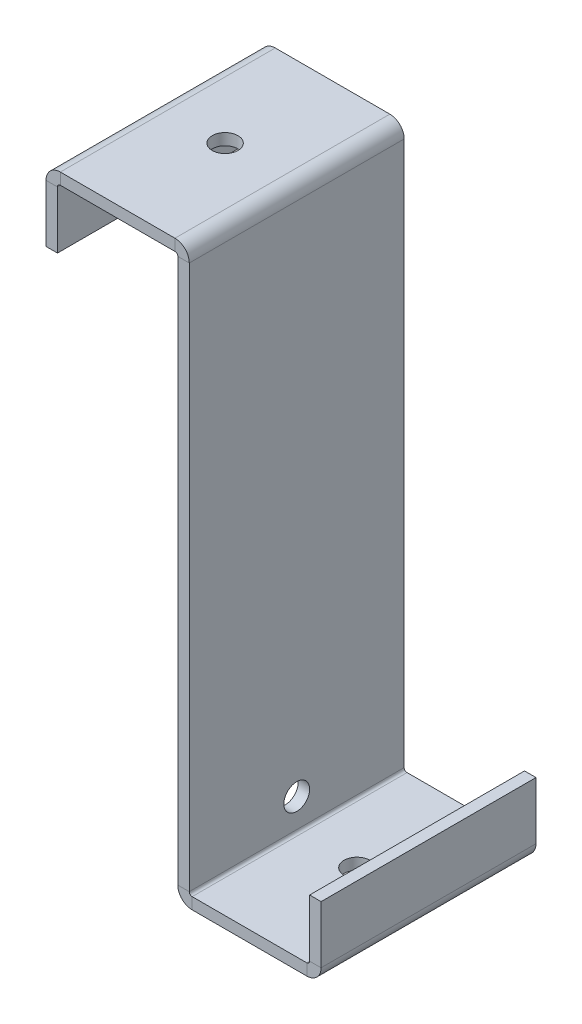
ISO-10303-21;
HEADER;
FILE_DESCRIPTION(('STEP AP214'),'2;1');
FILE_NAME('part.step','',(''),(''),'','','');
FILE_SCHEMA(('AUTOMOTIVE_DESIGN { 1 0 10303 214 1 1 1 1 }'));
ENDSEC;
DATA;
#1=APPLICATION_CONTEXT('core data for automotive mechanical design processes');
#2=APPLICATION_PROTOCOL_DEFINITION('international standard','automotive_design',2000,#1);
#3=PRODUCT_CONTEXT('',#1,'mechanical');
#4=PRODUCT('Part','Part','',(#3));
#5=PRODUCT_RELATED_PRODUCT_CATEGORY('part','',(#4));
#6=PRODUCT_DEFINITION_FORMATION('','',#4);
#7=PRODUCT_DEFINITION_CONTEXT('part definition',#1,'design');
#8=PRODUCT_DEFINITION('design','',#6,#7);
#9=PRODUCT_DEFINITION_SHAPE('','',#8);
#10=(LENGTH_UNIT() NAMED_UNIT(*) SI_UNIT(.MILLI.,.METRE.));
#11=(NAMED_UNIT(*) PLANE_ANGLE_UNIT() SI_UNIT($,.RADIAN.));
#12=(NAMED_UNIT(*) SI_UNIT($,.STERADIAN.) SOLID_ANGLE_UNIT());
#13=UNCERTAINTY_MEASURE_WITH_UNIT(LENGTH_MEASURE(1.E-05),#10,'distance_accuracy_value','');
#14=(GEOMETRIC_REPRESENTATION_CONTEXT(3) GLOBAL_UNCERTAINTY_ASSIGNED_CONTEXT((#13)) GLOBAL_UNIT_ASSIGNED_CONTEXT((#10,
#11,#12)) REPRESENTATION_CONTEXT('',''));
#15=CARTESIAN_POINT('',(0.,0.,0.));
#16=DIRECTION('',(0.,0.,1.));
#17=DIRECTION('',(1.,0.,0.));
#18=AXIS2_PLACEMENT_3D('',#15,#16,#17);
#19=CARTESIAN_POINT('',(3.99999999999999,0.,-37.5));
#20=DIRECTION('',(0.,0.,1.));
#21=DIRECTION('',(1.,0.,0.));
#22=AXIS2_PLACEMENT_3D('',#19,#20,#21);
#23=PLANE('',#22);
#24=DIRECTION('',(-1.24900090270315E-13,-1.,0.));
#25=VECTOR('',#24,1.);
#26=CARTESIAN_POINT('',(45.,3.99999999999973,-37.5));
#27=LINE('',#26,#25);
#28=CARTESIAN_POINT('',(45.,3.99999999999973,-37.5));
#29=VERTEX_POINT('',#28);
#30=CARTESIAN_POINT('',(44.9999999999995,-2.70616862252382E-13,-37.5));
#31=VERTEX_POINT('',#30);
#32=EDGE_CURVE('E303',#29,#31,#27,.T.);
#33=ORIENTED_EDGE('',*,*,#32,.T.);
#34=DIRECTION('',(-1.,0.,0.));
#35=VECTOR('',#34,1.);
#36=CARTESIAN_POINT('',(3.99999999999999,0.,-37.5));
#37=LINE('',#36,#35);
#38=CARTESIAN_POINT('',(4.99999999999998,0.,-37.5));
#39=VERTEX_POINT('',#38);
#40=EDGE_CURVE('E369',#39,#31,#37,.F.);
#41=ORIENTED_EDGE('',*,*,#40,.F.);
#42=DIRECTION('',(0.,1.,0.));
#43=VECTOR('',#42,1.);
#44=CARTESIAN_POINT('',(5.,3.99999999999999,-37.5));
#45=LINE('',#44,#43);
#46=CARTESIAN_POINT('',(5.,3.99999999999999,-37.5));
#47=VERTEX_POINT('',#46);
#48=EDGE_CURVE('E380',#47,#39,#45,.F.);
#49=ORIENTED_EDGE('',*,*,#48,.F.);
#50=DIRECTION('',(1.,0.,0.));
#51=VECTOR('',#50,1.);
#52=CARTESIAN_POINT('',(4.,3.99999999999999,-37.5));
#53=LINE('',#52,#51);
#54=EDGE_CURVE('E374',#47,#29,#53,.T.);
#55=ORIENTED_EDGE('',*,*,#54,.T.);
#56=EDGE_LOOP('',(#33,#41,#49,#55));
#57=FACE_BOUND('',#56,.T.);
#58=ADVANCED_FACE('F114',(#57),#23,.F.);
#59=CARTESIAN_POINT('',(50.,-1.67400815431762E-13,37.5));
#60=DIRECTION('',(0.,0.,-1.));
#61=DIRECTION('',(-1.,0.,0.));
#62=AXIS2_PLACEMENT_3D('',#59,#60,#61);
#63=PLANE('',#62);
#64=DIRECTION('',(-1.28369537222268E-13,-1.,0.));
#65=VECTOR('',#64,1.);
#66=CARTESIAN_POINT('',(44.9999999999998,3.99999999999973,37.5));
#67=LINE('',#66,#65);
#68=CARTESIAN_POINT('',(44.9999999999998,3.99999999999973,37.5));
#69=VERTEX_POINT('',#68);
#70=CARTESIAN_POINT('',(44.9999999999997,-1.50089628796475E-13,37.5));
#71=VERTEX_POINT('',#70);
#72=EDGE_CURVE('E310',#69,#71,#67,.T.);
#73=ORIENTED_EDGE('',*,*,#72,.F.);
#74=DIRECTION('',(-1.,0.,0.));
#75=VECTOR('',#74,1.);
#76=CARTESIAN_POINT('',(50.,3.99999999999983,37.5));
#77=LINE('',#76,#75);
#78=CARTESIAN_POINT('',(5.,3.99999999999999,37.5));
#79=VERTEX_POINT('',#78);
#80=EDGE_CURVE('E372',#69,#79,#77,.T.);
#81=ORIENTED_EDGE('',*,*,#80,.T.);
#82=DIRECTION('',(0.,1.,0.));
#83=VECTOR('',#82,1.);
#84=CARTESIAN_POINT('',(4.99999999999998,0.,37.5));
#85=LINE('',#84,#83);
#86=CARTESIAN_POINT('',(4.99999999999998,0.,37.5));
#87=VERTEX_POINT('',#86);
#88=EDGE_CURVE('E363',#79,#87,#85,.F.);
#89=ORIENTED_EDGE('',*,*,#88,.T.);
#90=DIRECTION('',(1.,0.,0.));
#91=VECTOR('',#90,1.);
#92=CARTESIAN_POINT('',(4.00000000000002,0.,37.5));
#93=LINE('',#92,#91);
#94=EDGE_CURVE('E366',#71,#87,#93,.F.);
#95=ORIENTED_EDGE('',*,*,#94,.F.);
#96=EDGE_LOOP('',(#73,#81,#89,#95));
#97=FACE_BOUND('',#96,.T.);
#98=ADVANCED_FACE('F519',(#97),#63,.F.);
#99=CARTESIAN_POINT('',(3.99999999999999,0.,-37.5));
#100=DIRECTION('',(0.,-1.,0.));
#101=DIRECTION('',(1.,0.,0.));
#102=AXIS2_PLACEMENT_3D('',#99,#100,#101);
#103=PLANE('',#102);
#104=CARTESIAN_POINT('',(25.0000000000003,0.,0.));
#105=DIRECTION('',(0.,-1.,0.));
#106=DIRECTION('',(1.,0.,0.));
#107=AXIS2_PLACEMENT_3D('',#104,#105,#106);
#108=CIRCLE('',#107,4.5);
#109=CARTESIAN_POINT('',(29.5000000000003,-1.02348685082633E-13,0.));
#110=VERTEX_POINT('',#109);
#111=EDGE_CURVE('E558',#110,#110,#108,.T.);
#112=ORIENTED_EDGE('',*,*,#111,.F.);
#113=EDGE_LOOP('',(#112));
#114=FACE_BOUND('',#113,.T.);
#115=ORIENTED_EDGE('',*,*,#40,.T.);
#116=DIRECTION('',(0.,0.,-1.));
#117=VECTOR('',#116,1.);
#118=CARTESIAN_POINT('',(44.9999999999995,-2.70616862252382E-13,-37.5));
#119=LINE('',#118,#117);
#120=EDGE_CURVE('E257',#31,#71,#119,.F.);
#121=ORIENTED_EDGE('',*,*,#120,.T.);
#122=ORIENTED_EDGE('',*,*,#94,.T.);
#123=DIRECTION('',(0.,0.,-1.));
#124=VECTOR('',#123,1.);
#125=CARTESIAN_POINT('',(4.99999999999998,0.,-37.5));
#126=LINE('',#125,#124);
#127=EDGE_CURVE('E377',#87,#39,#126,.T.);
#128=ORIENTED_EDGE('',*,*,#127,.T.);
#129=EDGE_LOOP('',(#115,#121,#122,#128));
#130=FACE_BOUND('',#129,.T.);
#131=ADVANCED_FACE('F533',(#114,#130),#103,.T.);
#132=CARTESIAN_POINT('',(4.,3.99999999999999,-37.5));
#133=DIRECTION('',(0.,-1.,0.));
#134=DIRECTION('',(1.,0.,0.));
#135=AXIS2_PLACEMENT_3D('',#132,#133,#134);
#136=PLANE('',#135);
#137=CARTESIAN_POINT('',(25.0000000000004,3.99999999999991,0.));
#138=DIRECTION('',(0.,-1.,0.));
#139=DIRECTION('',(1.,0.,0.));
#140=AXIS2_PLACEMENT_3D('',#137,#138,#139);
#141=CIRCLE('',#140,4.5);
#142=CARTESIAN_POINT('',(29.5000000000004,3.9999999999999,0.));
#143=VERTEX_POINT('',#142);
#144=EDGE_CURVE('E555',#143,#143,#141,.T.);
#145=ORIENTED_EDGE('',*,*,#144,.T.);
#146=EDGE_LOOP('',(#145));
#147=FACE_BOUND('',#146,.T.);
#148=DIRECTION('',(0.,0.,-1.));
#149=VECTOR('',#148,1.);
#150=CARTESIAN_POINT('',(45.,3.99999999999973,-37.5));
#151=LINE('',#150,#149);
#152=EDGE_CURVE('E307',#29,#69,#151,.F.);
#153=ORIENTED_EDGE('',*,*,#152,.F.);
#154=ORIENTED_EDGE('',*,*,#54,.F.);
#155=DIRECTION('',(0.,0.,1.));
#156=VECTOR('',#155,1.);
#157=CARTESIAN_POINT('',(5.,3.99999999999999,37.5));
#158=LINE('',#157,#156);
#159=EDGE_CURVE('E383',#79,#47,#158,.F.);
#160=ORIENTED_EDGE('',*,*,#159,.F.);
#161=ORIENTED_EDGE('',*,*,#80,.F.);
#162=EDGE_LOOP('',(#153,#154,#160,#161));
#163=FACE_BOUND('',#162,.T.);
#164=ADVANCED_FACE('F523',(#147,#163),#136,.F.);
#165=CARTESIAN_POINT('',(0.,200.,-37.5));
#166=DIRECTION('',(0.,0.,-1.));
#167=DIRECTION('',(-1.,0.,0.));
#168=AXIS2_PLACEMENT_3D('',#165,#166,#167);
#169=PLANE('',#168);
#170=DIRECTION('',(-1.,0.,0.));
#171=VECTOR('',#170,1.);
#172=CARTESIAN_POINT('',(0.,196.,-37.5));
#173=LINE('',#172,#171);
#174=CARTESIAN_POINT('',(-41.,196.,-37.5000000000002));
#175=VERTEX_POINT('',#174);
#176=CARTESIAN_POINT('',(-1.,196.,-37.5));
#177=VERTEX_POINT('',#176);
#178=EDGE_CURVE('E416',#175,#177,#173,.F.);
#179=ORIENTED_EDGE('',*,*,#178,.F.);
#180=DIRECTION('',(0.,1.,0.));
#181=VECTOR('',#180,1.);
#182=CARTESIAN_POINT('',(-41.,196.,-37.5000000000002));
#183=LINE('',#182,#181);
#184=CARTESIAN_POINT('',(-41.,200.,-37.5000000000002));
#185=VERTEX_POINT('',#184);
#186=EDGE_CURVE('E351',#175,#185,#183,.T.);
#187=ORIENTED_EDGE('',*,*,#186,.T.);
#188=DIRECTION('',(1.,0.,0.));
#189=VECTOR('',#188,1.);
#190=CARTESIAN_POINT('',(0.,200.,-37.5));
#191=LINE('',#190,#189);
#192=CARTESIAN_POINT('',(-0.999999999999986,200.,-37.5));
#193=VERTEX_POINT('',#192);
#194=EDGE_CURVE('E410',#185,#193,#191,.T.);
#195=ORIENTED_EDGE('',*,*,#194,.T.);
#196=DIRECTION('',(0.,1.,0.));
#197=VECTOR('',#196,1.);
#198=CARTESIAN_POINT('',(-1.,196.,-37.5));
#199=LINE('',#198,#197);
#200=EDGE_CURVE('E424',#177,#193,#199,.T.);
#201=ORIENTED_EDGE('',*,*,#200,.F.);
#202=EDGE_LOOP('',(#179,#187,#195,#201));
#203=FACE_BOUND('',#202,.T.);
#204=ADVANCED_FACE('F497',(#203),#169,.T.);
#205=CARTESIAN_POINT('',(0.,200.,-37.5));
#206=DIRECTION('',(0.,1.,0.));
#207=DIRECTION('',(-1.,0.,0.));
#208=AXIS2_PLACEMENT_3D('',#205,#206,#207);
#209=PLANE('',#208);
#210=CARTESIAN_POINT('',(-20.9999999999996,200.,-1.48029736616688E-13));
#211=DIRECTION('',(0.,1.,0.));
#212=DIRECTION('',(-1.,0.,0.));
#213=AXIS2_PLACEMENT_3D('',#210,#211,#212);
#214=CIRCLE('',#213,4.5);
#215=CARTESIAN_POINT('',(-25.4999999999996,200.,-1.48029736616688E-13));
#216=VERTEX_POINT('',#215);
#217=EDGE_CURVE('E552',#216,#216,#214,.T.);
#218=ORIENTED_EDGE('',*,*,#217,.F.);
#219=EDGE_LOOP('',(#218));
#220=FACE_BOUND('',#219,.T.);
#221=ORIENTED_EDGE('',*,*,#194,.F.);
#222=DIRECTION('',(0.,0.,-1.));
#223=VECTOR('',#222,1.);
#224=CARTESIAN_POINT('',(-41.,200.,-37.5000000000002));
#225=LINE('',#224,#223);
#226=CARTESIAN_POINT('',(-41.,200.,37.4999999999998));
#227=VERTEX_POINT('',#226);
#228=EDGE_CURVE('E346',#185,#227,#225,.F.);
#229=ORIENTED_EDGE('',*,*,#228,.T.);
#230=DIRECTION('',(-1.,0.,0.));
#231=VECTOR('',#230,1.);
#232=CARTESIAN_POINT('',(-46.,200.,37.4999999999998));
#233=LINE('',#232,#231);
#234=CARTESIAN_POINT('',(-0.999999999999986,200.,37.5));
#235=VERTEX_POINT('',#234);
#236=EDGE_CURVE('E413',#235,#227,#233,.T.);
#237=ORIENTED_EDGE('',*,*,#236,.F.);
#238=DIRECTION('',(0.,0.,-1.));
#239=VECTOR('',#238,1.);
#240=CARTESIAN_POINT('',(-0.999999999999986,200.,-37.5));
#241=LINE('',#240,#239);
#242=EDGE_CURVE('E421',#235,#193,#241,.T.);
#243=ORIENTED_EDGE('',*,*,#242,.T.);
#244=EDGE_LOOP('',(#221,#229,#237,#243));
#245=FACE_BOUND('',#244,.T.);
#246=ADVANCED_FACE('F490',(#220,#245),#209,.T.);
#247=CARTESIAN_POINT('',(0.,196.,-37.5));
#248=DIRECTION('',(0.,1.,0.));
#249=DIRECTION('',(-1.,0.,0.));
#250=AXIS2_PLACEMENT_3D('',#247,#248,#249);
#251=PLANE('',#250);
#252=CARTESIAN_POINT('',(-20.9999999999996,196.,-1.48399810958229E-13));
#253=DIRECTION('',(0.,1.,0.));
#254=DIRECTION('',(-1.,0.,0.));
#255=AXIS2_PLACEMENT_3D('',#252,#253,#254);
#256=CIRCLE('',#255,4.5);
#257=CARTESIAN_POINT('',(-25.4999999999996,196.,-1.48399810958229E-13));
#258=VERTEX_POINT('',#257);
#259=EDGE_CURVE('E301',#258,#258,#256,.T.);
#260=ORIENTED_EDGE('',*,*,#259,.T.);
#261=EDGE_LOOP('',(#260));
#262=FACE_BOUND('',#261,.T.);
#263=DIRECTION('',(0.,0.,-1.));
#264=VECTOR('',#263,1.);
#265=CARTESIAN_POINT('',(-41.,196.,-37.5000000000002));
#266=LINE('',#265,#264);
#267=CARTESIAN_POINT('',(-41.,196.,37.4999999999998));
#268=VERTEX_POINT('',#267);
#269=EDGE_CURVE('E357',#175,#268,#266,.F.);
#270=ORIENTED_EDGE('',*,*,#269,.F.);
#271=ORIENTED_EDGE('',*,*,#178,.T.);
#272=DIRECTION('',(0.,0.,1.));
#273=VECTOR('',#272,1.);
#274=CARTESIAN_POINT('',(-1.,196.,37.4999999999999));
#275=LINE('',#274,#273);
#276=CARTESIAN_POINT('',(-1.,196.,37.5));
#277=VERTEX_POINT('',#276);
#278=EDGE_CURVE('E427',#277,#177,#275,.F.);
#279=ORIENTED_EDGE('',*,*,#278,.F.);
#280=DIRECTION('',(1.,0.,0.));
#281=VECTOR('',#280,1.);
#282=CARTESIAN_POINT('',(-3.1677559126533E-13,196.,37.5));
#283=LINE('',#282,#281);
#284=EDGE_CURVE('E418',#277,#268,#283,.F.);
#285=ORIENTED_EDGE('',*,*,#284,.T.);
#286=EDGE_LOOP('',(#270,#271,#279,#285));
#287=FACE_BOUND('',#286,.T.);
#288=ADVANCED_FACE('F479',(#262,#287),#251,.F.);
#289=CARTESIAN_POINT('',(4.,200.,37.5));
#290=DIRECTION('',(0.,0.,-1.));
#291=DIRECTION('',(0.,1.,0.));
#292=AXIS2_PLACEMENT_3D('',#289,#290,#291);
#293=PLANE('',#292);
#294=DIRECTION('',(-1.,0.,0.));
#295=VECTOR('',#294,1.);
#296=CARTESIAN_POINT('',(4.,4.99999999999999,37.5));
#297=LINE('',#296,#295);
#298=CARTESIAN_POINT('',(4.,4.99999999999999,37.5));
#299=VERTEX_POINT('',#298);
#300=CARTESIAN_POINT('',(0.,4.99999999999998,37.5));
#301=VERTEX_POINT('',#300);
#302=EDGE_CURVE('E404',#299,#301,#297,.T.);
#303=ORIENTED_EDGE('',*,*,#302,.F.);
#304=DIRECTION('',(0.,-1.,0.));
#305=VECTOR('',#304,1.);
#306=CARTESIAN_POINT('',(4.,200.,37.5));
#307=LINE('',#306,#305);
#308=CARTESIAN_POINT('',(4.,195.,37.5));
#309=VERTEX_POINT('',#308);
#310=EDGE_CURVE('E123',#309,#299,#307,.T.);
#311=ORIENTED_EDGE('',*,*,#310,.F.);
#312=DIRECTION('',(1.,0.,0.));
#313=VECTOR('',#312,1.);
#314=CARTESIAN_POINT('',(0.,195.,37.5));
#315=LINE('',#314,#313);
#316=CARTESIAN_POINT('',(0.,195.,37.5));
#317=VERTEX_POINT('',#316);
#318=EDGE_CURVE('E449',#317,#309,#315,.T.);
#319=ORIENTED_EDGE('',*,*,#318,.F.);
#320=DIRECTION('',(0.,-1.,0.));
#321=VECTOR('',#320,1.);
#322=CARTESIAN_POINT('',(0.,200.,37.5));
#323=LINE('',#322,#321);
#324=EDGE_CURVE('E452',#317,#301,#323,.T.);
#325=ORIENTED_EDGE('',*,*,#324,.T.);
#326=EDGE_LOOP('',(#303,#311,#319,#325));
#327=FACE_BOUND('',#326,.T.);
#328=ADVANCED_FACE('F116',(#327),#293,.F.);
#329=CARTESIAN_POINT('',(4.,200.,-37.5));
#330=DIRECTION('',(0.,0.,1.));
#331=DIRECTION('',(0.,-1.,0.));
#332=AXIS2_PLACEMENT_3D('',#329,#330,#331);
#333=PLANE('',#332);
#334=DIRECTION('',(-1.,0.,0.));
#335=VECTOR('',#334,1.);
#336=CARTESIAN_POINT('',(4.,4.99999999999999,-37.5));
#337=LINE('',#336,#335);
#338=CARTESIAN_POINT('',(4.,4.99999999999999,-37.5));
#339=VERTEX_POINT('',#338);
#340=CARTESIAN_POINT('',(0.,4.99999999999999,-37.5));
#341=VERTEX_POINT('',#340);
#342=EDGE_CURVE('E394',#339,#341,#337,.T.);
#343=ORIENTED_EDGE('',*,*,#342,.T.);
#344=DIRECTION('',(0.,1.,0.));
#345=VECTOR('',#344,1.);
#346=CARTESIAN_POINT('',(0.,200.,-37.5));
#347=LINE('',#346,#345);
#348=CARTESIAN_POINT('',(0.,195.,-37.5));
#349=VERTEX_POINT('',#348);
#350=EDGE_CURVE('E118',#341,#349,#347,.T.);
#351=ORIENTED_EDGE('',*,*,#350,.T.);
#352=DIRECTION('',(1.,0.,0.));
#353=VECTOR('',#352,1.);
#354=CARTESIAN_POINT('',(0.,195.,-37.5));
#355=LINE('',#354,#353);
#356=CARTESIAN_POINT('',(4.00000000000002,195.,-37.5));
#357=VERTEX_POINT('',#356);
#358=EDGE_CURVE('E438',#349,#357,#355,.T.);
#359=ORIENTED_EDGE('',*,*,#358,.T.);
#360=DIRECTION('',(0.,1.,0.));
#361=VECTOR('',#360,1.);
#362=CARTESIAN_POINT('',(4.,200.,-37.5));
#363=LINE('',#362,#361);
#364=EDGE_CURVE('E13',#339,#357,#363,.T.);
#365=ORIENTED_EDGE('',*,*,#364,.F.);
#366=EDGE_LOOP('',(#343,#351,#359,#365));
#367=FACE_BOUND('',#366,.T.);
#368=ADVANCED_FACE('F462',(#367),#333,.F.);
#369=CARTESIAN_POINT('',(4.,0.,37.5));
#370=DIRECTION('',(-1.,0.,0.));
#371=DIRECTION('',(0.,0.,1.));
#372=AXIS2_PLACEMENT_3D('',#369,#370,#371);
#373=PLANE('',#372);
#374=CARTESIAN_POINT('',(4.,15.0000000000009,0.));
#375=DIRECTION('',(-1.,0.,0.));
#376=DIRECTION('',(0.,0.,1.));
#377=AXIS2_PLACEMENT_3D('',#374,#375,#376);
#378=CIRCLE('',#377,4.5);
#379=CARTESIAN_POINT('',(4.,15.0000000000009,4.5));
#380=VERTEX_POINT('',#379);
#381=EDGE_CURVE('E561',#380,#380,#378,.T.);
#382=ORIENTED_EDGE('',*,*,#381,.T.);
#383=EDGE_LOOP('',(#382));
#384=FACE_BOUND('',#383,.T.);
#385=DIRECTION('',(0.,0.,-1.));
#386=VECTOR('',#385,1.);
#387=CARTESIAN_POINT('',(4.,4.99999999999999,-37.5));
#388=LINE('',#387,#386);
#389=EDGE_CURVE('E400',#339,#299,#388,.F.);
#390=ORIENTED_EDGE('',*,*,#389,.F.);
#391=ORIENTED_EDGE('',*,*,#364,.T.);
#392=DIRECTION('',(0.,0.,-1.));
#393=VECTOR('',#392,1.);
#394=CARTESIAN_POINT('',(4.00000000000002,195.,-37.5));
#395=LINE('',#394,#393);
#396=EDGE_CURVE('E432',#357,#309,#395,.F.);
#397=ORIENTED_EDGE('',*,*,#396,.T.);
#398=ORIENTED_EDGE('',*,*,#310,.T.);
#399=EDGE_LOOP('',(#390,#391,#397,#398));
#400=FACE_BOUND('',#399,.T.);
#401=ADVANCED_FACE('F507',(#384,#400),#373,.F.);
#402=CARTESIAN_POINT('',(0.,0.,37.5));
#403=DIRECTION('',(-1.,0.,0.));
#404=DIRECTION('',(0.,0.,1.));
#405=AXIS2_PLACEMENT_3D('',#402,#403,#404);
#406=PLANE('',#405);
#407=CARTESIAN_POINT('',(0.,15.0000000000009,0.));
#408=DIRECTION('',(-1.,0.,0.));
#409=DIRECTION('',(0.,0.,1.));
#410=AXIS2_PLACEMENT_3D('',#407,#408,#409);
#411=CIRCLE('',#410,4.5);
#412=CARTESIAN_POINT('',(0.,15.0000000000009,4.5));
#413=VERTEX_POINT('',#412);
#414=EDGE_CURVE('E564',#413,#413,#411,.T.);
#415=ORIENTED_EDGE('',*,*,#414,.F.);
#416=EDGE_LOOP('',(#415));
#417=FACE_BOUND('',#416,.T.);
#418=ORIENTED_EDGE('',*,*,#350,.F.);
#419=DIRECTION('',(0.,0.,-1.));
#420=VECTOR('',#419,1.);
#421=CARTESIAN_POINT('',(0.,4.99999999999999,-37.5));
#422=LINE('',#421,#420);
#423=EDGE_CURVE('E387',#341,#301,#422,.F.);
#424=ORIENTED_EDGE('',*,*,#423,.T.);
#425=ORIENTED_EDGE('',*,*,#324,.F.);
#426=DIRECTION('',(0.,0.,-1.));
#427=VECTOR('',#426,1.);
#428=CARTESIAN_POINT('',(0.,195.,-37.5));
#429=LINE('',#428,#427);
#430=EDGE_CURVE('E444',#349,#317,#429,.F.);
#431=ORIENTED_EDGE('',*,*,#430,.F.);
#432=EDGE_LOOP('',(#418,#424,#425,#431));
#433=FACE_BOUND('',#432,.T.);
#434=ADVANCED_FACE('F466',(#417,#433),#406,.T.);
#435=CARTESIAN_POINT('',(-1.,195.,37.5));
#436=DIRECTION('',(0.,0.,1.));
#437=DIRECTION('',(1.,0.,0.));
#438=AXIS2_PLACEMENT_3D('',#435,#436,#437);
#439=PLANE('',#438);
#440=DIRECTION('',(0.,1.,0.));
#441=VECTOR('',#440,1.);
#442=CARTESIAN_POINT('',(-0.999999999999987,200.,37.5));
#443=LINE('',#442,#441);
#444=EDGE_CURVE('E407',#277,#235,#443,.T.);
#445=ORIENTED_EDGE('',*,*,#444,.F.);
#446=CARTESIAN_POINT('',(-1.,195.,37.5));
#447=DIRECTION('',(0.,0.,-1.));
#448=DIRECTION('',(-1.,0.,0.));
#449=AXIS2_PLACEMENT_3D('',#446,#447,#448);
#450=CIRCLE('',#449,1.00000000000003);
#451=EDGE_CURVE('E441',#317,#277,#450,.F.);
#452=ORIENTED_EDGE('',*,*,#451,.F.);
#453=ORIENTED_EDGE('',*,*,#318,.T.);
#454=CARTESIAN_POINT('',(-1.,195.,37.5));
#455=DIRECTION('',(0.,0.,-1.));
#456=DIRECTION('',(-1.,0.,0.));
#457=AXIS2_PLACEMENT_3D('',#454,#455,#456);
#458=CIRCLE('',#457,5.00000000000003);
#459=EDGE_CURVE('E434',#309,#235,#458,.F.);
#460=ORIENTED_EDGE('',*,*,#459,.T.);
#461=EDGE_LOOP('',(#445,#452,#453,#460));
#462=FACE_BOUND('',#461,.T.);
#463=ADVANCED_FACE('F503',(#462),#439,.T.);
#464=CARTESIAN_POINT('',(-1.,195.,-37.5));
#465=DIRECTION('',(0.,0.,1.));
#466=DIRECTION('',(1.,0.,0.));
#467=AXIS2_PLACEMENT_3D('',#464,#465,#466);
#468=PLANE('',#467);
#469=CARTESIAN_POINT('',(-1.,195.,-37.5));
#470=DIRECTION('',(0.,0.,-1.));
#471=DIRECTION('',(-1.,0.,0.));
#472=AXIS2_PLACEMENT_3D('',#469,#470,#471);
#473=CIRCLE('',#472,1.00000000000003);
#474=EDGE_CURVE('E412',#177,#349,#473,.T.);
#475=ORIENTED_EDGE('',*,*,#474,.F.);
#476=ORIENTED_EDGE('',*,*,#200,.T.);
#477=CARTESIAN_POINT('',(-1.,195.,-37.5));
#478=DIRECTION('',(0.,0.,-1.));
#479=DIRECTION('',(-1.,0.,0.));
#480=AXIS2_PLACEMENT_3D('',#477,#478,#479);
#481=CIRCLE('',#480,5.00000000000003);
#482=EDGE_CURVE('E435',#193,#357,#481,.T.);
#483=ORIENTED_EDGE('',*,*,#482,.T.);
#484=ORIENTED_EDGE('',*,*,#358,.F.);
#485=EDGE_LOOP('',(#475,#476,#483,#484));
#486=FACE_BOUND('',#485,.T.);
#487=ADVANCED_FACE('F471',(#486),#468,.F.);
#488=CARTESIAN_POINT('',(-1.,195.,-37.5));
#489=DIRECTION('',(0.,0.,-1.));
#490=DIRECTION('',(0.,1.,0.));
#491=AXIS2_PLACEMENT_3D('',#488,#489,#490);
#492=CYLINDRICAL_SURFACE('',#491,5.00000000000003);
#493=ORIENTED_EDGE('',*,*,#396,.F.);
#494=ORIENTED_EDGE('',*,*,#482,.F.);
#495=ORIENTED_EDGE('',*,*,#242,.F.);
#496=ORIENTED_EDGE('',*,*,#459,.F.);
#497=EDGE_LOOP('',(#493,#494,#495,#496));
#498=FACE_BOUND('',#497,.T.);
#499=ADVANCED_FACE('F501',(#498),#492,.T.);
#500=CARTESIAN_POINT('',(-1.,195.,-37.5));
#501=DIRECTION('',(0.,0.,-1.));
#502=DIRECTION('',(0.,1.,0.));
#503=AXIS2_PLACEMENT_3D('',#500,#501,#502);
#504=CYLINDRICAL_SURFACE('',#503,1.00000000000003);
#505=ORIENTED_EDGE('',*,*,#430,.T.);
#506=ORIENTED_EDGE('',*,*,#451,.T.);
#507=ORIENTED_EDGE('',*,*,#278,.T.);
#508=ORIENTED_EDGE('',*,*,#474,.T.);
#509=EDGE_LOOP('',(#505,#506,#507,#508));
#510=FACE_BOUND('',#509,.T.);
#511=ADVANCED_FACE('F474',(#510),#504,.F.);
#512=CARTESIAN_POINT('',(-46.,200.,37.4999999999998));
#513=DIRECTION('',(0.,0.,1.));
#514=DIRECTION('',(1.,0.,0.));
#515=AXIS2_PLACEMENT_3D('',#512,#513,#514);
#516=PLANE('',#515);
#517=DIRECTION('',(0.,1.,0.));
#518=VECTOR('',#517,1.);
#519=CARTESIAN_POINT('',(-41.,196.,37.4999999999998));
#520=LINE('',#519,#518);
#521=EDGE_CURVE('E361',#268,#227,#520,.T.);
#522=ORIENTED_EDGE('',*,*,#521,.F.);
#523=ORIENTED_EDGE('',*,*,#284,.F.);
#524=ORIENTED_EDGE('',*,*,#444,.T.);
#525=ORIENTED_EDGE('',*,*,#236,.T.);
#526=EDGE_LOOP('',(#522,#523,#524,#525));
#527=FACE_BOUND('',#526,.T.);
#528=ADVANCED_FACE('F483',(#527),#516,.T.);
#529=CARTESIAN_POINT('',(5.,4.99999999999999,37.5));
#530=DIRECTION('',(0.,0.,1.));
#531=DIRECTION('',(1.,0.,0.));
#532=AXIS2_PLACEMENT_3D('',#529,#530,#531);
#533=PLANE('',#532);
#534=ORIENTED_EDGE('',*,*,#88,.F.);
#535=CARTESIAN_POINT('',(5.,4.99999999999999,37.5));
#536=DIRECTION('',(0.,0.,-1.));
#537=DIRECTION('',(-1.,0.,0.));
#538=AXIS2_PLACEMENT_3D('',#535,#536,#537);
#539=CIRCLE('',#538,1.);
#540=EDGE_CURVE('E397',#299,#79,#539,.F.);
#541=ORIENTED_EDGE('',*,*,#540,.F.);
#542=ORIENTED_EDGE('',*,*,#302,.T.);
#543=CARTESIAN_POINT('',(5.,4.99999999999999,37.5));
#544=DIRECTION('',(0.,0.,-1.));
#545=DIRECTION('',(-1.,0.,0.));
#546=AXIS2_PLACEMENT_3D('',#543,#544,#545);
#547=CIRCLE('',#546,5.);
#548=EDGE_CURVE('E390',#301,#87,#547,.F.);
#549=ORIENTED_EDGE('',*,*,#548,.T.);
#550=EDGE_LOOP('',(#534,#541,#542,#549));
#551=FACE_BOUND('',#550,.T.);
#552=ADVANCED_FACE('F515',(#551),#533,.T.);
#553=CARTESIAN_POINT('',(5.,4.99999999999999,-37.5));
#554=DIRECTION('',(0.,0.,1.));
#555=DIRECTION('',(1.,0.,0.));
#556=AXIS2_PLACEMENT_3D('',#553,#554,#555);
#557=PLANE('',#556);
#558=CARTESIAN_POINT('',(5.,4.99999999999999,-37.5));
#559=DIRECTION('',(0.,0.,-1.));
#560=DIRECTION('',(-1.,0.,0.));
#561=AXIS2_PLACEMENT_3D('',#558,#559,#560);
#562=CIRCLE('',#561,1.);
#563=EDGE_CURVE('E368',#47,#339,#562,.T.);
#564=ORIENTED_EDGE('',*,*,#563,.F.);
#565=ORIENTED_EDGE('',*,*,#48,.T.);
#566=CARTESIAN_POINT('',(5.,4.99999999999999,-37.5));
#567=DIRECTION('',(0.,0.,-1.));
#568=DIRECTION('',(-1.,0.,0.));
#569=AXIS2_PLACEMENT_3D('',#566,#567,#568);
#570=CIRCLE('',#569,5.);
#571=EDGE_CURVE('E391',#39,#341,#570,.T.);
#572=ORIENTED_EDGE('',*,*,#571,.T.);
#573=ORIENTED_EDGE('',*,*,#342,.F.);
#574=EDGE_LOOP('',(#564,#565,#572,#573));
#575=FACE_BOUND('',#574,.T.);
#576=ADVANCED_FACE('F527',(#575),#557,.F.);
#577=CARTESIAN_POINT('',(5.,4.99999999999999,-37.5));
#578=DIRECTION('',(0.,0.,-1.));
#579=DIRECTION('',(0.,-1.,0.));
#580=AXIS2_PLACEMENT_3D('',#577,#578,#579);
#581=CYLINDRICAL_SURFACE('',#580,5.);
#582=ORIENTED_EDGE('',*,*,#423,.F.);
#583=ORIENTED_EDGE('',*,*,#571,.F.);
#584=ORIENTED_EDGE('',*,*,#127,.F.);
#585=ORIENTED_EDGE('',*,*,#548,.F.);
#586=EDGE_LOOP('',(#582,#583,#584,#585));
#587=FACE_BOUND('',#586,.T.);
#588=ADVANCED_FACE('F530',(#587),#581,.T.);
#589=CARTESIAN_POINT('',(5.,4.99999999999999,-37.5));
#590=DIRECTION('',(0.,0.,-1.));
#591=DIRECTION('',(0.,-1.,0.));
#592=AXIS2_PLACEMENT_3D('',#589,#590,#591);
#593=CYLINDRICAL_SURFACE('',#592,1.);
#594=ORIENTED_EDGE('',*,*,#389,.T.);
#595=ORIENTED_EDGE('',*,*,#540,.T.);
#596=ORIENTED_EDGE('',*,*,#159,.T.);
#597=ORIENTED_EDGE('',*,*,#563,.T.);
#598=EDGE_LOOP('',(#594,#595,#596,#597));
#599=FACE_BOUND('',#598,.T.);
#600=ADVANCED_FACE('F510',(#599),#593,.F.);
#601=CARTESIAN_POINT('',(-41.,195.,37.4999999999998));
#602=DIRECTION('',(0.,0.,1.));
#603=DIRECTION('',(1.,0.,0.));
#604=AXIS2_PLACEMENT_3D('',#601,#602,#603);
#605=PLANE('',#604);
#606=DIRECTION('',(-1.,0.,0.));
#607=VECTOR('',#606,1.);
#608=CARTESIAN_POINT('',(-46.,195.,37.4999999999998));
#609=LINE('',#608,#607);
#610=CARTESIAN_POINT('',(-42.,195.,37.4999999999998));
#611=VERTEX_POINT('',#610);
#612=CARTESIAN_POINT('',(-46.,195.,37.4999999999998));
#613=VERTEX_POINT('',#612);
#614=EDGE_CURVE('E312',#611,#613,#609,.T.);
#615=ORIENTED_EDGE('',*,*,#614,.F.);
#616=CARTESIAN_POINT('',(-41.,195.,37.4999999999998));
#617=DIRECTION('',(0.,0.,-1.));
#618=DIRECTION('',(-1.,0.,0.));
#619=AXIS2_PLACEMENT_3D('',#616,#617,#618);
#620=CIRCLE('',#619,0.999999999999994);
#621=EDGE_CURVE('E354',#268,#611,#620,.F.);
#622=ORIENTED_EDGE('',*,*,#621,.F.);
#623=ORIENTED_EDGE('',*,*,#521,.T.);
#624=CARTESIAN_POINT('',(-41.,195.,37.4999999999998));
#625=DIRECTION('',(0.,0.,-1.));
#626=DIRECTION('',(-1.,0.,0.));
#627=AXIS2_PLACEMENT_3D('',#624,#625,#626);
#628=CIRCLE('',#627,4.99999999999999);
#629=EDGE_CURVE('E139',#227,#613,#628,.F.);
#630=ORIENTED_EDGE('',*,*,#629,.T.);
#631=EDGE_LOOP('',(#615,#622,#623,#630));
#632=FACE_BOUND('',#631,.T.);
#633=ADVANCED_FACE('F487',(#632),#605,.T.);
#634=CARTESIAN_POINT('',(-41.,195.,-37.5000000000002));
#635=DIRECTION('',(0.,0.,1.));
#636=DIRECTION('',(1.,0.,0.));
#637=AXIS2_PLACEMENT_3D('',#634,#635,#636);
#638=PLANE('',#637);
#639=CARTESIAN_POINT('',(-41.,195.,-37.5000000000002));
#640=DIRECTION('',(0.,0.,-1.));
#641=DIRECTION('',(-1.,0.,0.));
#642=AXIS2_PLACEMENT_3D('',#639,#640,#641);
#643=CIRCLE('',#642,0.999999999999994);
#644=CARTESIAN_POINT('',(-42.,195.,-37.5000000000002));
#645=VERTEX_POINT('',#644);
#646=EDGE_CURVE('E316',#645,#175,#643,.T.);
#647=ORIENTED_EDGE('',*,*,#646,.F.);
#648=DIRECTION('',(-1.,0.,0.));
#649=VECTOR('',#648,1.);
#650=CARTESIAN_POINT('',(-42.,195.,-37.5000000000002));
#651=LINE('',#650,#649);
#652=CARTESIAN_POINT('',(-46.,195.,-37.5000000000002));
#653=VERTEX_POINT('',#652);
#654=EDGE_CURVE('E339',#645,#653,#651,.T.);
#655=ORIENTED_EDGE('',*,*,#654,.T.);
#656=CARTESIAN_POINT('',(-41.,195.,-37.5000000000002));
#657=DIRECTION('',(0.,0.,-1.));
#658=DIRECTION('',(-1.,0.,0.));
#659=AXIS2_PLACEMENT_3D('',#656,#657,#658);
#660=CIRCLE('',#659,4.99999999999999);
#661=EDGE_CURVE('E349',#653,#185,#660,.T.);
#662=ORIENTED_EDGE('',*,*,#661,.T.);
#663=ORIENTED_EDGE('',*,*,#186,.F.);
#664=EDGE_LOOP('',(#647,#655,#662,#663));
#665=FACE_BOUND('',#664,.T.);
#666=ADVANCED_FACE('F494',(#665),#638,.F.);
#667=CARTESIAN_POINT('',(-41.,195.,-37.5000000000002));
#668=DIRECTION('',(0.,0.,-1.));
#669=DIRECTION('',(-1.,0.,0.));
#670=AXIS2_PLACEMENT_3D('',#667,#668,#669);
#671=CYLINDRICAL_SURFACE('',#670,4.99999999999999);
#672=ORIENTED_EDGE('',*,*,#228,.F.);
#673=ORIENTED_EDGE('',*,*,#661,.F.);
#674=DIRECTION('',(0.,0.,-1.));
#675=VECTOR('',#674,1.);
#676=CARTESIAN_POINT('',(-46.,195.,-37.5000000000002));
#677=LINE('',#676,#675);
#678=EDGE_CURVE('E336',#613,#653,#677,.T.);
#679=ORIENTED_EDGE('',*,*,#678,.F.);
#680=ORIENTED_EDGE('',*,*,#629,.F.);
#681=EDGE_LOOP('',(#672,#673,#679,#680));
#682=FACE_BOUND('',#681,.T.);
#683=ADVANCED_FACE('F491',(#682),#671,.T.);
#684=CARTESIAN_POINT('',(-41.,195.,-37.5000000000002));
#685=DIRECTION('',(0.,0.,-1.));
#686=DIRECTION('',(-1.,0.,0.));
#687=AXIS2_PLACEMENT_3D('',#684,#685,#686);
#688=CYLINDRICAL_SURFACE('',#687,0.999999999999994);
#689=ORIENTED_EDGE('',*,*,#269,.T.);
#690=ORIENTED_EDGE('',*,*,#621,.T.);
#691=DIRECTION('',(0.,0.,1.));
#692=VECTOR('',#691,1.);
#693=CARTESIAN_POINT('',(-42.,195.,37.4999999999998));
#694=LINE('',#693,#692);
#695=EDGE_CURVE('E342',#611,#645,#694,.F.);
#696=ORIENTED_EDGE('',*,*,#695,.T.);
#697=ORIENTED_EDGE('',*,*,#646,.T.);
#698=EDGE_LOOP('',(#689,#690,#696,#697));
#699=FACE_BOUND('',#698,.T.);
#700=ADVANCED_FACE('F668',(#699),#688,.F.);
#701=CARTESIAN_POINT('',(-46.,196.,-37.5000000000002));
#702=DIRECTION('',(0.,0.,-1.));
#703=DIRECTION('',(0.,1.,0.));
#704=AXIS2_PLACEMENT_3D('',#701,#702,#703);
#705=PLANE('',#704);
#706=DIRECTION('',(0.,1.,0.));
#707=VECTOR('',#706,1.);
#708=CARTESIAN_POINT('',(-46.,196.,-37.5000000000002));
#709=LINE('',#708,#707);
#710=CARTESIAN_POINT('',(-46.0000000000002,175.,-37.5000000000002));
#711=VERTEX_POINT('',#710);
#712=EDGE_CURVE('E320',#711,#653,#709,.T.);
#713=ORIENTED_EDGE('',*,*,#712,.T.);
#714=ORIENTED_EDGE('',*,*,#654,.F.);
#715=DIRECTION('',(0.,-1.,0.));
#716=VECTOR('',#715,1.);
#717=CARTESIAN_POINT('',(-42.,196.,-37.5000000000002));
#718=LINE('',#717,#716);
#719=CARTESIAN_POINT('',(-42.0000000000002,175.,-37.5000000000002));
#720=VERTEX_POINT('',#719);
#721=EDGE_CURVE('E328',#720,#645,#718,.F.);
#722=ORIENTED_EDGE('',*,*,#721,.F.);
#723=DIRECTION('',(1.,0.,0.));
#724=VECTOR('',#723,1.);
#725=CARTESIAN_POINT('',(-46.0000000000002,175.,-37.5000000000002));
#726=LINE('',#725,#724);
#727=EDGE_CURVE('E314',#711,#720,#726,.T.);
#728=ORIENTED_EDGE('',*,*,#727,.F.);
#729=EDGE_LOOP('',(#713,#714,#722,#728));
#730=FACE_BOUND('',#729,.T.);
#731=ADVANCED_FACE('F675',(#730),#705,.T.);
#732=CARTESIAN_POINT('',(-46.0000000000002,175.,37.4999999999998));
#733=DIRECTION('',(0.,0.,1.));
#734=DIRECTION('',(0.,-1.,0.));
#735=AXIS2_PLACEMENT_3D('',#732,#733,#734);
#736=PLANE('',#735);
#737=DIRECTION('',(0.,1.,0.));
#738=VECTOR('',#737,1.);
#739=CARTESIAN_POINT('',(-42.,196.,37.4999999999998));
#740=LINE('',#739,#738);
#741=CARTESIAN_POINT('',(-42.0000000000002,175.,37.4999999999998));
#742=VERTEX_POINT('',#741);
#743=EDGE_CURVE('E334',#611,#742,#740,.F.);
#744=ORIENTED_EDGE('',*,*,#743,.F.);
#745=ORIENTED_EDGE('',*,*,#614,.T.);
#746=DIRECTION('',(0.,-1.,0.));
#747=VECTOR('',#746,1.);
#748=CARTESIAN_POINT('',(-46.0000000000002,175.,37.4999999999998));
#749=LINE('',#748,#747);
#750=CARTESIAN_POINT('',(-46.0000000000002,175.,37.4999999999998));
#751=VERTEX_POINT('',#750);
#752=EDGE_CURVE('E326',#613,#751,#749,.T.);
#753=ORIENTED_EDGE('',*,*,#752,.T.);
#754=DIRECTION('',(1.,0.,0.));
#755=VECTOR('',#754,1.);
#756=CARTESIAN_POINT('',(-46.0000000000002,175.,37.4999999999998));
#757=LINE('',#756,#755);
#758=EDGE_CURVE('E317',#751,#742,#757,.T.);
#759=ORIENTED_EDGE('',*,*,#758,.T.);
#760=EDGE_LOOP('',(#744,#745,#753,#759));
#761=FACE_BOUND('',#760,.T.);
#762=ADVANCED_FACE('F683',(#761),#736,.T.);
#763=CARTESIAN_POINT('',(-46.,196.,-37.5000000000002));
#764=DIRECTION('',(-1.,0.,0.));
#765=DIRECTION('',(0.,-1.,0.));
#766=AXIS2_PLACEMENT_3D('',#763,#764,#765);
#767=PLANE('',#766);
#768=ORIENTED_EDGE('',*,*,#752,.F.);
#769=ORIENTED_EDGE('',*,*,#678,.T.);
#770=ORIENTED_EDGE('',*,*,#712,.F.);
#771=DIRECTION('',(0.,0.,-1.));
#772=VECTOR('',#771,1.);
#773=CARTESIAN_POINT('',(-46.0000000000002,175.,-37.5000000000002));
#774=LINE('',#773,#772);
#775=EDGE_CURVE('E323',#751,#711,#774,.T.);
#776=ORIENTED_EDGE('',*,*,#775,.F.);
#777=EDGE_LOOP('',(#768,#769,#770,#776));
#778=FACE_BOUND('',#777,.T.);
#779=ADVANCED_FACE('F691',(#778),#767,.T.);
#780=CARTESIAN_POINT('',(-42.,196.,-37.5000000000002));
#781=DIRECTION('',(-1.,0.,0.));
#782=DIRECTION('',(0.,-1.,0.));
#783=AXIS2_PLACEMENT_3D('',#780,#781,#782);
#784=PLANE('',#783);
#785=ORIENTED_EDGE('',*,*,#695,.F.);
#786=ORIENTED_EDGE('',*,*,#743,.T.);
#787=DIRECTION('',(0.,0.,1.));
#788=VECTOR('',#787,1.);
#789=CARTESIAN_POINT('',(-42.0000000000002,175.,-37.5000000000002));
#790=LINE('',#789,#788);
#791=EDGE_CURVE('E331',#742,#720,#790,.F.);
#792=ORIENTED_EDGE('',*,*,#791,.T.);
#793=ORIENTED_EDGE('',*,*,#721,.T.);
#794=EDGE_LOOP('',(#785,#786,#792,#793));
#795=FACE_BOUND('',#794,.T.);
#796=ADVANCED_FACE('F699',(#795),#784,.F.);
#797=CARTESIAN_POINT('',(-46.0000000000002,175.,-37.5000000000002));
#798=DIRECTION('',(0.,-1.,0.));
#799=DIRECTION('',(1.,0.,0.));
#800=AXIS2_PLACEMENT_3D('',#797,#798,#799);
#801=PLANE('',#800);
#802=ORIENTED_EDGE('',*,*,#791,.F.);
#803=ORIENTED_EDGE('',*,*,#758,.F.);
#804=ORIENTED_EDGE('',*,*,#775,.T.);
#805=ORIENTED_EDGE('',*,*,#727,.T.);
#806=EDGE_LOOP('',(#802,#803,#804,#805));
#807=FACE_BOUND('',#806,.T.);
#808=ADVANCED_FACE('F707',(#807),#801,.T.);
#809=CARTESIAN_POINT('',(44.9999999999999,4.99999999999985,37.5));
#810=DIRECTION('',(0.,0.,1.));
#811=DIRECTION('',(1.,0.,0.));
#812=AXIS2_PLACEMENT_3D('',#809,#810,#811);
#813=PLANE('',#812);
#814=DIRECTION('',(-1.,0.,0.));
#815=VECTOR('',#814,1.);
#816=CARTESIAN_POINT('',(50.,4.99999999999981,37.5));
#817=LINE('',#816,#815);
#818=CARTESIAN_POINT('',(46.,4.99999999999984,37.5));
#819=VERTEX_POINT('',#818);
#820=CARTESIAN_POINT('',(50.,4.99999999999981,37.5));
#821=VERTEX_POINT('',#820);
#822=EDGE_CURVE('E298',#819,#821,#817,.F.);
#823=ORIENTED_EDGE('',*,*,#822,.F.);
#824=CARTESIAN_POINT('',(44.9999999999999,4.99999999999985,37.5));
#825=DIRECTION('',(0.,0.,-1.));
#826=DIRECTION('',(-1.,0.,0.));
#827=AXIS2_PLACEMENT_3D('',#824,#825,#826);
#828=CIRCLE('',#827,1.00000000000012);
#829=EDGE_CURVE('E260',#69,#819,#828,.F.);
#830=ORIENTED_EDGE('',*,*,#829,.F.);
#831=ORIENTED_EDGE('',*,*,#72,.T.);
#832=CARTESIAN_POINT('',(44.9999999999999,4.99999999999985,37.5));
#833=DIRECTION('',(0.,0.,-1.));
#834=DIRECTION('',(-1.,0.,0.));
#835=AXIS2_PLACEMENT_3D('',#832,#833,#834);
#836=CIRCLE('',#835,5.00000000000012);
#837=EDGE_CURVE('E131',#71,#821,#836,.F.);
#838=ORIENTED_EDGE('',*,*,#837,.T.);
#839=EDGE_LOOP('',(#823,#830,#831,#838));
#840=FACE_BOUND('',#839,.T.);
#841=ADVANCED_FACE('F715',(#840),#813,.T.);
#842=CARTESIAN_POINT('',(45.0000000000001,4.99999999999985,-37.5));
#843=DIRECTION('',(0.,0.,1.));
#844=DIRECTION('',(1.,0.,0.));
#845=AXIS2_PLACEMENT_3D('',#842,#843,#844);
#846=PLANE('',#845);
#847=CARTESIAN_POINT('',(45.0000000000001,4.99999999999985,-37.5));
#848=DIRECTION('',(0.,0.,-1.));
#849=DIRECTION('',(-1.,0.,0.));
#850=AXIS2_PLACEMENT_3D('',#847,#848,#849);
#851=CIRCLE('',#850,1.00000000000012);
#852=CARTESIAN_POINT('',(46.0000000000003,4.99999999999984,-37.5));
#853=VERTEX_POINT('',#852);
#854=EDGE_CURVE('E267',#853,#29,#851,.T.);
#855=ORIENTED_EDGE('',*,*,#854,.F.);
#856=DIRECTION('',(-1.,0.,0.));
#857=VECTOR('',#856,1.);
#858=CARTESIAN_POINT('',(46.,4.99999999999984,-37.5));
#859=LINE('',#858,#857);
#860=CARTESIAN_POINT('',(50.,4.99999999999982,-37.5));
#861=VERTEX_POINT('',#860);
#862=EDGE_CURVE('E264',#853,#861,#859,.F.);
#863=ORIENTED_EDGE('',*,*,#862,.T.);
#864=CARTESIAN_POINT('',(45.0000000000001,4.99999999999985,-37.5));
#865=DIRECTION('',(0.,0.,-1.));
#866=DIRECTION('',(-1.,0.,0.));
#867=AXIS2_PLACEMENT_3D('',#864,#865,#866);
#868=CIRCLE('',#867,5.00000000000012);
#869=EDGE_CURVE('E251',#861,#31,#868,.T.);
#870=ORIENTED_EDGE('',*,*,#869,.T.);
#871=ORIENTED_EDGE('',*,*,#32,.F.);
#872=EDGE_LOOP('',(#855,#863,#870,#871));
#873=FACE_BOUND('',#872,.T.);
#874=ADVANCED_FACE('F265',(#873),#846,.F.);
#875=CARTESIAN_POINT('',(45.0000000000001,4.99999999999985,-37.5));
#876=DIRECTION('',(0.,0.,-1.));
#877=DIRECTION('',(1.,0.,0.));
#878=AXIS2_PLACEMENT_3D('',#875,#876,#877);
#879=CYLINDRICAL_SURFACE('',#878,5.00000000000012);
#880=ORIENTED_EDGE('',*,*,#120,.F.);
#881=ORIENTED_EDGE('',*,*,#869,.F.);
#882=DIRECTION('',(0.,0.,-1.));
#883=VECTOR('',#882,1.);
#884=CARTESIAN_POINT('',(50.,4.99999999999981,37.5));
#885=LINE('',#884,#883);
#886=EDGE_CURVE('E255',#821,#861,#885,.T.);
#887=ORIENTED_EDGE('',*,*,#886,.F.);
#888=ORIENTED_EDGE('',*,*,#837,.F.);
#889=EDGE_LOOP('',(#880,#881,#887,#888));
#890=FACE_BOUND('',#889,.T.);
#891=ADVANCED_FACE('F253',(#890),#879,.T.);
#892=CARTESIAN_POINT('',(45.0000000000001,4.99999999999985,-37.5));
#893=DIRECTION('',(0.,0.,-1.));
#894=DIRECTION('',(1.,0.,0.));
#895=AXIS2_PLACEMENT_3D('',#892,#893,#894);
#896=CYLINDRICAL_SURFACE('',#895,1.00000000000012);
#897=ORIENTED_EDGE('',*,*,#152,.T.);
#898=ORIENTED_EDGE('',*,*,#829,.T.);
#899=DIRECTION('',(0.,0.,1.));
#900=VECTOR('',#899,1.);
#901=CARTESIAN_POINT('',(46.,4.99999999999984,37.5));
#902=LINE('',#901,#900);
#903=EDGE_CURVE('E271',#819,#853,#902,.F.);
#904=ORIENTED_EDGE('',*,*,#903,.T.);
#905=ORIENTED_EDGE('',*,*,#854,.T.);
#906=EDGE_LOOP('',(#897,#898,#904,#905));
#907=FACE_BOUND('',#906,.T.);
#908=ADVANCED_FACE('F536',(#907),#896,.F.);
#909=CARTESIAN_POINT('',(50.,3.99999999999982,-37.5));
#910=DIRECTION('',(0.,0.,1.));
#911=DIRECTION('',(0.,-1.,0.));
#912=AXIS2_PLACEMENT_3D('',#909,#910,#911);
#913=PLANE('',#912);
#914=ORIENTED_EDGE('',*,*,#862,.F.);
#915=DIRECTION('',(0.,1.,0.));
#916=VECTOR('',#915,1.);
#917=CARTESIAN_POINT('',(46.,3.99999999999985,-37.5));
#918=LINE('',#917,#916);
#919=CARTESIAN_POINT('',(46.0000000000002,24.9999999999999,-37.5000000000001));
#920=VERTEX_POINT('',#919);
#921=EDGE_CURVE('E280',#853,#920,#918,.T.);
#922=ORIENTED_EDGE('',*,*,#921,.T.);
#923=DIRECTION('',(-1.,0.,0.));
#924=VECTOR('',#923,1.);
#925=CARTESIAN_POINT('',(50.0000000000002,24.9999999999998,-37.5000000000001));
#926=LINE('',#925,#924);
#927=CARTESIAN_POINT('',(50.0000000000002,24.9999999999998,-37.5000000000001));
#928=VERTEX_POINT('',#927);
#929=EDGE_CURVE('E284',#928,#920,#926,.T.);
#930=ORIENTED_EDGE('',*,*,#929,.F.);
#931=DIRECTION('',(0.,-1.,0.));
#932=VECTOR('',#931,1.);
#933=CARTESIAN_POINT('',(50.,3.99999999999975,-37.5));
#934=LINE('',#933,#932);
#935=EDGE_CURVE('E276',#861,#928,#934,.F.);
#936=ORIENTED_EDGE('',*,*,#935,.F.);
#937=EDGE_LOOP('',(#914,#922,#930,#936));
#938=FACE_BOUND('',#937,.T.);
#939=ADVANCED_FACE('F282',(#938),#913,.F.);
#940=CARTESIAN_POINT('',(50.0000000000001,24.9999999999998,37.5));
#941=DIRECTION('',(0.,0.,-1.));
#942=DIRECTION('',(0.,1.,0.));
#943=AXIS2_PLACEMENT_3D('',#940,#941,#942);
#944=PLANE('',#943);
#945=ORIENTED_EDGE('',*,*,#822,.T.);
#946=DIRECTION('',(0.,1.,0.));
#947=VECTOR('',#946,1.);
#948=CARTESIAN_POINT('',(50.,3.99999999999982,37.5));
#949=LINE('',#948,#947);
#950=CARTESIAN_POINT('',(50.0000000000001,24.9999999999998,37.5));
#951=VERTEX_POINT('',#950);
#952=EDGE_CURVE('E279',#951,#821,#949,.F.);
#953=ORIENTED_EDGE('',*,*,#952,.F.);
#954=DIRECTION('',(-1.,0.,0.));
#955=VECTOR('',#954,1.);
#956=CARTESIAN_POINT('',(50.0000000000001,24.9999999999998,37.5));
#957=LINE('',#956,#955);
#958=CARTESIAN_POINT('',(46.0000000000001,24.9999999999999,37.5));
#959=VERTEX_POINT('',#958);
#960=EDGE_CURVE('E547',#951,#959,#957,.T.);
#961=ORIENTED_EDGE('',*,*,#960,.T.);
#962=DIRECTION('',(0.,-1.,0.));
#963=VECTOR('',#962,1.);
#964=CARTESIAN_POINT('',(46.0000000000001,24.9999999999999,37.5));
#965=LINE('',#964,#963);
#966=EDGE_CURVE('E287',#959,#819,#965,.T.);
#967=ORIENTED_EDGE('',*,*,#966,.T.);
#968=EDGE_LOOP('',(#945,#953,#961,#967));
#969=FACE_BOUND('',#968,.T.);
#970=ADVANCED_FACE('F545',(#969),#944,.F.);
#971=CARTESIAN_POINT('',(50.,3.99999999999982,37.5));
#972=DIRECTION('',(1.,0.,0.));
#973=DIRECTION('',(0.,1.,0.));
#974=AXIS2_PLACEMENT_3D('',#971,#972,#973);
#975=PLANE('',#974);
#976=ORIENTED_EDGE('',*,*,#952,.T.);
#977=ORIENTED_EDGE('',*,*,#886,.T.);
#978=ORIENTED_EDGE('',*,*,#935,.T.);
#979=DIRECTION('',(0.,0.,-1.));
#980=VECTOR('',#979,1.);
#981=CARTESIAN_POINT('',(50.0000000000001,24.9999999999998,37.5));
#982=LINE('',#981,#980);
#983=EDGE_CURVE('E286',#928,#951,#982,.F.);
#984=ORIENTED_EDGE('',*,*,#983,.T.);
#985=EDGE_LOOP('',(#976,#977,#978,#984));
#986=FACE_BOUND('',#985,.T.);
#987=ADVANCED_FACE('F275',(#986),#975,.T.);
#988=CARTESIAN_POINT('',(46.,3.99999999999985,37.5));
#989=DIRECTION('',(1.,0.,0.));
#990=DIRECTION('',(0.,1.,0.));
#991=AXIS2_PLACEMENT_3D('',#988,#989,#990);
#992=PLANE('',#991);
#993=ORIENTED_EDGE('',*,*,#903,.F.);
#994=ORIENTED_EDGE('',*,*,#966,.F.);
#995=DIRECTION('',(0.,0.,1.));
#996=VECTOR('',#995,1.);
#997=CARTESIAN_POINT('',(46.0000000000002,24.9999999999999,-37.5000000000001));
#998=LINE('',#997,#996);
#999=EDGE_CURVE('E291',#920,#959,#998,.T.);
#1000=ORIENTED_EDGE('',*,*,#999,.F.);
#1001=ORIENTED_EDGE('',*,*,#921,.F.);
#1002=EDGE_LOOP('',(#993,#994,#1000,#1001));
#1003=FACE_BOUND('',#1002,.T.);
#1004=ADVANCED_FACE('F541',(#1003),#992,.F.);
#1005=CARTESIAN_POINT('',(50.0000000000002,24.9999999999998,-37.5000000000001));
#1006=DIRECTION('',(0.,-1.,0.));
#1007=DIRECTION('',(1.,0.,0.));
#1008=AXIS2_PLACEMENT_3D('',#1005,#1006,#1007);
#1009=PLANE('',#1008);
#1010=ORIENTED_EDGE('',*,*,#999,.T.);
#1011=ORIENTED_EDGE('',*,*,#960,.F.);
#1012=ORIENTED_EDGE('',*,*,#983,.F.);
#1013=ORIENTED_EDGE('',*,*,#929,.T.);
#1014=EDGE_LOOP('',(#1010,#1011,#1012,#1013));
#1015=FACE_BOUND('',#1014,.T.);
#1016=ADVANCED_FACE('F766',(#1015),#1009,.F.);
#1017=CARTESIAN_POINT('',(-20.9999999999996,196.,-1.48399810958229E-13));
#1018=DIRECTION('',(0.,1.,0.));
#1019=DIRECTION('',(-1.,0.,0.));
#1020=AXIS2_PLACEMENT_3D('',#1017,#1018,#1019);
#1021=CYLINDRICAL_SURFACE('',#1020,4.5);
#1022=ORIENTED_EDGE('',*,*,#259,.F.);
#1023=EDGE_LOOP('',(#1022));
#1024=FACE_BOUND('',#1023,.T.);
#1025=ORIENTED_EDGE('',*,*,#217,.T.);
#1026=EDGE_LOOP('',(#1025));
#1027=FACE_BOUND('',#1026,.T.);
#1028=ADVANCED_FACE('F773',(#1024,#1027),#1021,.F.);
#1029=CARTESIAN_POINT('',(25.0000000000004,3.99999999999991,0.));
#1030=DIRECTION('',(0.,-1.,0.));
#1031=DIRECTION('',(1.,0.,0.));
#1032=AXIS2_PLACEMENT_3D('',#1029,#1030,#1031);
#1033=CYLINDRICAL_SURFACE('',#1032,4.5);
#1034=ORIENTED_EDGE('',*,*,#144,.F.);
#1035=EDGE_LOOP('',(#1034));
#1036=FACE_BOUND('',#1035,.T.);
#1037=ORIENTED_EDGE('',*,*,#111,.T.);
#1038=EDGE_LOOP('',(#1037));
#1039=FACE_BOUND('',#1038,.T.);
#1040=ADVANCED_FACE('F574',(#1036,#1039),#1033,.F.);
#1041=CARTESIAN_POINT('',(4.,15.0000000000009,0.));
#1042=DIRECTION('',(-1.,0.,0.));
#1043=DIRECTION('',(0.,0.,1.));
#1044=AXIS2_PLACEMENT_3D('',#1041,#1042,#1043);
#1045=CYLINDRICAL_SURFACE('',#1044,4.5);
#1046=ORIENTED_EDGE('',*,*,#381,.F.);
#1047=EDGE_LOOP('',(#1046));
#1048=FACE_BOUND('',#1047,.T.);
#1049=ORIENTED_EDGE('',*,*,#414,.T.);
#1050=EDGE_LOOP('',(#1049));
#1051=FACE_BOUND('',#1050,.T.);
#1052=ADVANCED_FACE('F571',(#1048,#1051),#1045,.F.);
#1053=CLOSED_SHELL('',(#58,#98,#131,#164,#204,#246,#288,#328,#368,#401,#434,#463,#487,#499,#511,
#528,#552,#576,#588,#600,#633,#666,#683,#700,#731,#762,#779,#796,#808,#841,#874,#891,#908,#939,
#970,#987,#1004,#1016,#1028,#1040,#1052));
#1054=MANIFOLD_SOLID_BREP('B2',#1053);
#1055=ADVANCED_BREP_SHAPE_REPRESENTATION('',(#18,#1054),#14);
#1056=SHAPE_DEFINITION_REPRESENTATION(#9,#1055);
ENDSEC;
END-ISO-10303-21;
